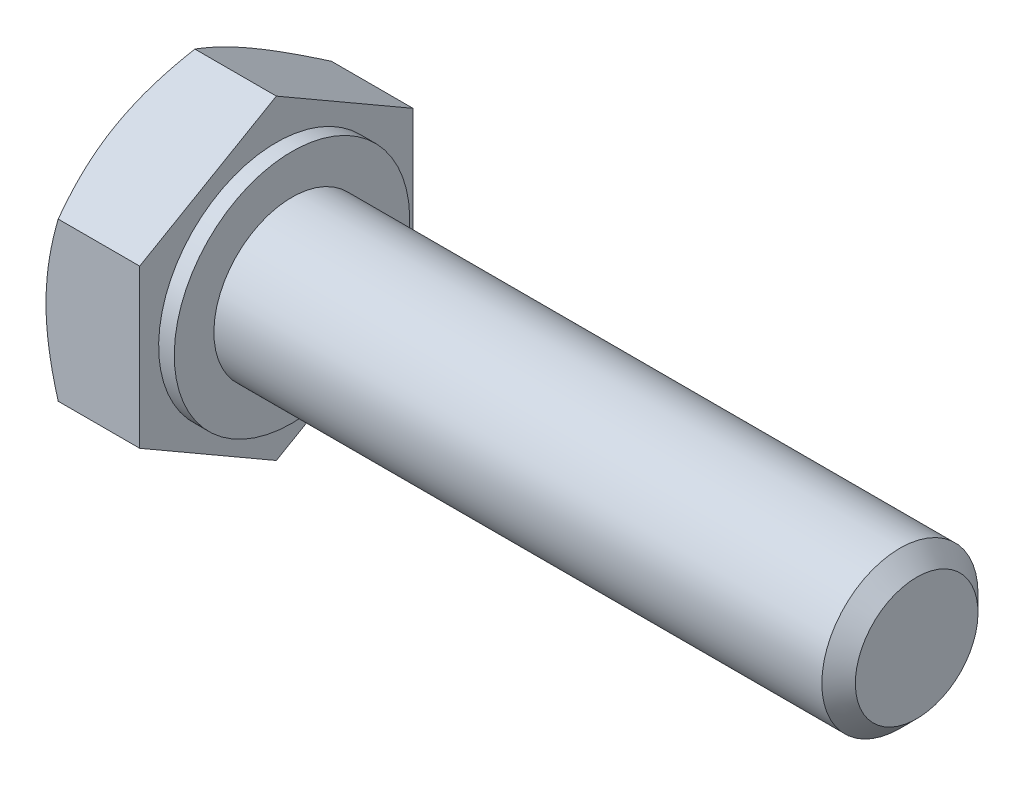
ISO-10303-21;
HEADER;
FILE_DESCRIPTION(('STEP AP214'),'2;1');
FILE_NAME('part.step','',(''),(''),'','','');
FILE_SCHEMA(('AUTOMOTIVE_DESIGN { 1 0 10303 214 1 1 1 1 }'));
ENDSEC;
DATA;
#1=APPLICATION_CONTEXT('core data for automotive mechanical design processes');
#2=APPLICATION_PROTOCOL_DEFINITION('international standard','automotive_design',2000,#1);
#3=PRODUCT_CONTEXT('',#1,'mechanical');
#4=PRODUCT('Part','Part','',(#3));
#5=PRODUCT_RELATED_PRODUCT_CATEGORY('part','',(#4));
#6=PRODUCT_DEFINITION_FORMATION('','',#4);
#7=PRODUCT_DEFINITION_CONTEXT('part definition',#1,'design');
#8=PRODUCT_DEFINITION('design','',#6,#7);
#9=PRODUCT_DEFINITION_SHAPE('','',#8);
#10=(LENGTH_UNIT() NAMED_UNIT(*) SI_UNIT(.MILLI.,.METRE.));
#11=(NAMED_UNIT(*) PLANE_ANGLE_UNIT() SI_UNIT($,.RADIAN.));
#12=(NAMED_UNIT(*) SI_UNIT($,.STERADIAN.) SOLID_ANGLE_UNIT());
#13=UNCERTAINTY_MEASURE_WITH_UNIT(LENGTH_MEASURE(1.E-05),#10,'distance_accuracy_value','');
#14=(GEOMETRIC_REPRESENTATION_CONTEXT(3) GLOBAL_UNCERTAINTY_ASSIGNED_CONTEXT((#13)) GLOBAL_UNIT_ASSIGNED_CONTEXT((#10,
#11,#12)) REPRESENTATION_CONTEXT('',''));
#15=CARTESIAN_POINT('',(0.,0.,0.));
#16=DIRECTION('',(0.,0.,1.));
#17=DIRECTION('',(1.,0.,0.));
#18=AXIS2_PLACEMENT_3D('',#15,#16,#17);
#19=CARTESIAN_POINT('',(0.,2.5075,0.));
#20=DIRECTION('',(1.,0.,0.));
#21=DIRECTION('',(0.,1.,0.));
#22=AXIS2_PLACEMENT_3D('',#19,#20,#21);
#23=PLANE('',#22);
#24=CARTESIAN_POINT('',(0.,0.,0.));
#25=DIRECTION('',(1.,0.,0.));
#26=DIRECTION('',(0.,1.,0.));
#27=AXIS2_PLACEMENT_3D('',#24,#25,#26);
#28=CIRCLE('',#27,2.);
#29=CARTESIAN_POINT('',(0.,-2.,0.));
#30=VERTEX_POINT('',#29);
#31=EDGE_CURVE('E130',#30,#30,#28,.T.);
#32=ORIENTED_EDGE('',*,*,#31,.F.);
#33=EDGE_LOOP('',(#32));
#34=FACE_BOUND('',#33,.T.);
#35=CARTESIAN_POINT('',(0.,0.,0.));
#36=DIRECTION('',(1.,0.,0.));
#37=DIRECTION('',(0.,1.,0.));
#38=AXIS2_PLACEMENT_3D('',#35,#36,#37);
#39=CIRCLE('',#38,3.015);
#40=CARTESIAN_POINT('',(0.,-3.015,0.));
#41=VERTEX_POINT('',#40);
#42=EDGE_CURVE('E30',#41,#41,#39,.T.);
#43=ORIENTED_EDGE('',*,*,#42,.T.);
#44=EDGE_LOOP('',(#43));
#45=FACE_BOUND('',#44,.T.);
#46=ADVANCED_FACE('F17',(#34,#45),#23,.T.);
#47=CARTESIAN_POINT('',(-0.200049999999994,0.,0.));
#48=DIRECTION('',(1.,0.,0.));
#49=DIRECTION('',(0.,1.,0.));
#50=AXIS2_PLACEMENT_3D('',#47,#48,#49);
#51=CYLINDRICAL_SURFACE('',#50,3.015);
#52=ORIENTED_EDGE('',*,*,#42,.F.);
#53=DIRECTION('',(-1.,0.,0.));
#54=VECTOR('',#53,1.);
#55=CARTESIAN_POINT('',(-0.200049999999994,-3.015,0.));
#56=LINE('',#55,#54);
#57=CARTESIAN_POINT('',(-0.400099999999995,-3.015,0.));
#58=VERTEX_POINT('',#57);
#59=EDGE_CURVE('E11',#41,#58,#56,.T.);
#60=ORIENTED_EDGE('',*,*,#59,.T.);
#61=CARTESIAN_POINT('',(-0.400099999999994,0.,0.));
#62=DIRECTION('',(1.,0.,0.));
#63=DIRECTION('',(0.,1.,0.));
#64=AXIS2_PLACEMENT_3D('',#61,#62,#63);
#65=CIRCLE('',#64,3.015);
#66=EDGE_CURVE('E253',#58,#58,#65,.T.);
#67=ORIENTED_EDGE('',*,*,#66,.T.);
#68=ORIENTED_EDGE('',*,*,#59,.F.);
#69=EDGE_LOOP('',(#52,#60,#67,#68));
#70=FACE_BOUND('',#69,.T.);
#71=ADVANCED_FACE('F360',(#70),#51,.T.);
#72=CARTESIAN_POINT('',(-2.8001,0.,0.));
#73=DIRECTION('',(1.,0.,0.));
#74=DIRECTION('',(0.,1.,0.));
#75=AXIS2_PLACEMENT_3D('',#72,#73,#74);
#76=PLANE('',#75);
#77=CARTESIAN_POINT('',(-2.8001,0.,0.));
#78=DIRECTION('',(-1.,0.,0.));
#79=DIRECTION('',(0.,1.,0.));
#80=AXIS2_PLACEMENT_3D('',#77,#78,#79);
#81=CIRCLE('',#80,3.5);
#82=CARTESIAN_POINT('',(-2.8001,0.,3.5));
#83=VERTEX_POINT('',#82);
#84=CARTESIAN_POINT('',(-2.8001,3.03108891324553,1.75));
#85=VERTEX_POINT('',#84);
#86=EDGE_CURVE('E144',#83,#85,#81,.T.);
#87=ORIENTED_EDGE('',*,*,#86,.T.);
#88=CARTESIAN_POINT('',(-2.8001,0.,0.));
#89=DIRECTION('',(-1.,0.,0.));
#90=DIRECTION('',(0.,1.,0.));
#91=AXIS2_PLACEMENT_3D('',#88,#89,#90);
#92=CIRCLE('',#91,3.5);
#93=CARTESIAN_POINT('',(-2.8001,3.03108891324553,-1.75));
#94=VERTEX_POINT('',#93);
#95=EDGE_CURVE('E236',#85,#94,#92,.T.);
#96=ORIENTED_EDGE('',*,*,#95,.T.);
#97=CARTESIAN_POINT('',(-2.8001,0.,0.));
#98=DIRECTION('',(-1.,0.,0.));
#99=DIRECTION('',(0.,1.,0.));
#100=AXIS2_PLACEMENT_3D('',#97,#98,#99);
#101=CIRCLE('',#100,3.5);
#102=CARTESIAN_POINT('',(-2.8001,0.,-3.5));
#103=VERTEX_POINT('',#102);
#104=EDGE_CURVE('E186',#94,#103,#101,.T.);
#105=ORIENTED_EDGE('',*,*,#104,.T.);
#106=CARTESIAN_POINT('',(-2.8001,0.,0.));
#107=DIRECTION('',(-1.,0.,0.));
#108=DIRECTION('',(0.,1.,0.));
#109=AXIS2_PLACEMENT_3D('',#106,#107,#108);
#110=CIRCLE('',#109,3.5);
#111=CARTESIAN_POINT('',(-2.8001,-3.03108891324553,-1.75));
#112=VERTEX_POINT('',#111);
#113=EDGE_CURVE('E150',#103,#112,#110,.T.);
#114=ORIENTED_EDGE('',*,*,#113,.T.);
#115=CARTESIAN_POINT('',(-2.8001,0.,0.));
#116=DIRECTION('',(-1.,0.,0.));
#117=DIRECTION('',(0.,1.,0.));
#118=AXIS2_PLACEMENT_3D('',#115,#116,#117);
#119=CIRCLE('',#118,3.5);
#120=CARTESIAN_POINT('',(-2.8001,-3.03108891324553,1.75));
#121=VERTEX_POINT('',#120);
#122=EDGE_CURVE('E307',#112,#121,#119,.T.);
#123=ORIENTED_EDGE('',*,*,#122,.T.);
#124=CARTESIAN_POINT('',(-2.8001,0.,0.));
#125=DIRECTION('',(-1.,0.,0.));
#126=DIRECTION('',(0.,1.,0.));
#127=AXIS2_PLACEMENT_3D('',#124,#125,#126);
#128=CIRCLE('',#127,3.5);
#129=EDGE_CURVE('E222',#121,#83,#128,.T.);
#130=ORIENTED_EDGE('',*,*,#129,.T.);
#131=EDGE_LOOP('',(#87,#96,#105,#114,#123,#130));
#132=FACE_BOUND('',#131,.T.);
#133=ADVANCED_FACE('F366',(#132),#76,.F.);
#134=CARTESIAN_POINT('',(-0.400099999999993,-4.04145188432738,0.));
#135=DIRECTION('',(0.,-0.866025403784439,-0.5));
#136=DIRECTION('',(0.,0.5,-0.866025403784439));
#137=AXIS2_PLACEMENT_3D('',#134,#135,#136);
#138=PLANE('',#137);
#139=CARTESIAN_POINT('',(-2.8001,-3.03108891324553,-1.75));
#140=CARTESIAN_POINT('',(-2.80010000000001,-2.56217782649107,-2.56217782649106));
#141=CARTESIAN_POINT('',(-2.48749260883037,-2.0207259421637,-3.5));
#142=(BOUNDED_CURVE() B_SPLINE_CURVE(2,(#139,#140,#141),.UNSPECIFIED.,.F.,
.F.) B_SPLINE_CURVE_WITH_KNOTS((3,3),(0.204998401571332,0.409996803142664),
.UNSPECIFIED.) CURVE() GEOMETRIC_REPRESENTATION_ITEM() RATIONAL_B_SPLINE_CURVE((1.,
1.03795484930207,1.)) REPRESENTATION_ITEM(''));
#143=CARTESIAN_POINT('',(-2.48749260883038,-2.0207259421637,-3.5));
#144=VERTEX_POINT('',#143);
#145=EDGE_CURVE('E158',#112,#144,#142,.T.);
#146=ORIENTED_EDGE('',*,*,#145,.T.);
#147=DIRECTION('',(-1.,0.,0.));
#148=VECTOR('',#147,1.);
#149=CARTESIAN_POINT('',(-0.400099999999993,-2.02072594216369,-3.5));
#150=LINE('',#149,#148);
#151=CARTESIAN_POINT('',(-0.400099999999993,-2.02072594216369,-3.5));
#152=VERTEX_POINT('',#151);
#153=EDGE_CURVE('E212',#152,#144,#150,.T.);
#154=ORIENTED_EDGE('',*,*,#153,.F.);
#155=DIRECTION('',(0.,0.5,-0.866025403784439));
#156=VECTOR('',#155,1.);
#157=CARTESIAN_POINT('',(-0.400099999999993,-4.04145188432738,0.));
#158=LINE('',#157,#156);
#159=CARTESIAN_POINT('',(-0.400099999999993,-4.04145188432738,0.));
#160=VERTEX_POINT('',#159);
#161=EDGE_CURVE('E156',#160,#152,#158,.T.);
#162=ORIENTED_EDGE('',*,*,#161,.F.);
#163=DIRECTION('',(-1.,0.,0.));
#164=VECTOR('',#163,1.);
#165=CARTESIAN_POINT('',(-0.400099999999993,-4.04145188432738,0.));
#166=LINE('',#165,#164);
#167=CARTESIAN_POINT('',(-2.48749260883038,-4.04145188432736,0.));
#168=VERTEX_POINT('',#167);
#169=EDGE_CURVE('E252',#160,#168,#166,.T.);
#170=ORIENTED_EDGE('',*,*,#169,.T.);
#171=CARTESIAN_POINT('',(-2.48749260883038,-4.04145188432736,0.));
#172=CARTESIAN_POINT('',(-2.80010000000001,-3.49999999999999,-0.937822173508942));
#173=CARTESIAN_POINT('',(-2.8001,-3.03108891324553,-1.75));
#174=(BOUNDED_CURVE() B_SPLINE_CURVE(2,(#171,#172,#173),.UNSPECIFIED.,.F.,
.F.) B_SPLINE_CURVE_WITH_KNOTS((3,3),(0.,0.204998401571332),
.UNSPECIFIED.) CURVE() GEOMETRIC_REPRESENTATION_ITEM() RATIONAL_B_SPLINE_CURVE((1.,
1.03795484930205,1.)) REPRESENTATION_ITEM(''));
#175=EDGE_CURVE('E21',#168,#112,#174,.T.);
#176=ORIENTED_EDGE('',*,*,#175,.T.);
#177=EDGE_LOOP('',(#146,#154,#162,#170,#176));
#178=FACE_BOUND('',#177,.T.);
#179=ADVANCED_FACE('F386',(#178),#138,.T.);
#180=CARTESIAN_POINT('',(-0.400099999999993,-2.02072594216369,3.5));
#181=DIRECTION('',(0.,-0.866025403784439,0.5));
#182=DIRECTION('',(-1.,0.,0.));
#183=AXIS2_PLACEMENT_3D('',#180,#181,#182);
#184=PLANE('',#183);
#185=CARTESIAN_POINT('',(-2.8001,-3.03108891324553,1.75));
#186=CARTESIAN_POINT('',(-2.80010000000001,-3.49999999999999,0.937822173508936));
#187=CARTESIAN_POINT('',(-2.48749260883038,-4.04145188432736,0.));
#188=(BOUNDED_CURVE() B_SPLINE_CURVE(2,(#185,#186,#187),.UNSPECIFIED.,.F.,
.F.) B_SPLINE_CURVE_WITH_KNOTS((3,3),(0.204998401571332,0.409996803142664),
.UNSPECIFIED.) CURVE() GEOMETRIC_REPRESENTATION_ITEM() RATIONAL_B_SPLINE_CURVE((1.,
1.03795484930205,1.)) REPRESENTATION_ITEM(''));
#189=EDGE_CURVE('E298',#121,#168,#188,.T.);
#190=ORIENTED_EDGE('',*,*,#189,.T.);
#191=ORIENTED_EDGE('',*,*,#169,.F.);
#192=DIRECTION('',(0.,-0.5,-0.866025403784439));
#193=VECTOR('',#192,1.);
#194=CARTESIAN_POINT('',(-0.400099999999993,-2.02072594216369,3.5));
#195=LINE('',#194,#193);
#196=CARTESIAN_POINT('',(-0.400099999999993,-2.02072594216369,3.5));
#197=VERTEX_POINT('',#196);
#198=EDGE_CURVE('E152',#197,#160,#195,.T.);
#199=ORIENTED_EDGE('',*,*,#198,.F.);
#200=DIRECTION('',(-1.,0.,0.));
#201=VECTOR('',#200,1.);
#202=CARTESIAN_POINT('',(-0.400099999999993,-2.02072594216369,3.5));
#203=LINE('',#202,#201);
#204=CARTESIAN_POINT('',(-2.48749260883038,-2.02072594216366,3.5));
#205=VERTEX_POINT('',#204);
#206=EDGE_CURVE('E249',#197,#205,#203,.T.);
#207=ORIENTED_EDGE('',*,*,#206,.T.);
#208=CARTESIAN_POINT('',(-2.48749260883038,-2.02072594216371,3.5));
#209=CARTESIAN_POINT('',(-2.80010000000001,-2.56217782649108,2.56217782649106));
#210=CARTESIAN_POINT('',(-2.8001,-3.03108891324553,1.75));
#211=(BOUNDED_CURVE() B_SPLINE_CURVE(2,(#208,#209,#210),.UNSPECIFIED.,.F.,
.F.) B_SPLINE_CURVE_WITH_KNOTS((3,3),(0.,0.204998401571332),
.UNSPECIFIED.) CURVE() GEOMETRIC_REPRESENTATION_ITEM() RATIONAL_B_SPLINE_CURVE((1.,
1.03795484930205,1.)) REPRESENTATION_ITEM(''));
#212=EDGE_CURVE('E289',#205,#121,#211,.T.);
#213=ORIENTED_EDGE('',*,*,#212,.T.);
#214=EDGE_LOOP('',(#190,#191,#199,#207,#213));
#215=FACE_BOUND('',#214,.T.);
#216=ADVANCED_FACE('F383',(#215),#184,.T.);
#217=CARTESIAN_POINT('',(-0.400099999999994,2.02072594216369,3.5));
#218=DIRECTION('',(0.,0.,1.));
#219=DIRECTION('',(0.,-1.,0.));
#220=AXIS2_PLACEMENT_3D('',#217,#218,#219);
#221=PLANE('',#220);
#222=CARTESIAN_POINT('',(-2.8001,0.,3.5));
#223=CARTESIAN_POINT('',(-2.80010000000001,-0.937822173508923,3.5));
#224=CARTESIAN_POINT('',(-2.48749260883038,-2.02072594216366,3.5));
#225=(BOUNDED_CURVE() B_SPLINE_CURVE(2,(#222,#223,#224),.UNSPECIFIED.,.F.,
.F.) B_SPLINE_CURVE_WITH_KNOTS((3,3),(0.204998401571332,0.409996803142664),
.UNSPECIFIED.) CURVE() GEOMETRIC_REPRESENTATION_ITEM() RATIONAL_B_SPLINE_CURVE((1.,
1.03795484930203,1.)) REPRESENTATION_ITEM(''));
#226=EDGE_CURVE('E226',#83,#205,#225,.T.);
#227=ORIENTED_EDGE('',*,*,#226,.T.);
#228=ORIENTED_EDGE('',*,*,#206,.F.);
#229=DIRECTION('',(0.,-1.,0.));
#230=VECTOR('',#229,1.);
#231=CARTESIAN_POINT('',(-0.400099999999994,2.02072594216369,3.5));
#232=LINE('',#231,#230);
#233=CARTESIAN_POINT('',(-0.400099999999994,2.02072594216369,3.5));
#234=VERTEX_POINT('',#233);
#235=EDGE_CURVE('E157',#234,#197,#232,.T.);
#236=ORIENTED_EDGE('',*,*,#235,.F.);
#237=DIRECTION('',(-1.,0.,0.));
#238=VECTOR('',#237,1.);
#239=CARTESIAN_POINT('',(-0.400099999999994,2.02072594216369,3.5));
#240=LINE('',#239,#238);
#241=CARTESIAN_POINT('',(-2.48749260883038,2.02072594216366,3.5));
#242=VERTEX_POINT('',#241);
#243=EDGE_CURVE('E230',#234,#242,#240,.T.);
#244=ORIENTED_EDGE('',*,*,#243,.T.);
#245=CARTESIAN_POINT('',(-2.48749260883037,2.02072594216366,3.5));
#246=CARTESIAN_POINT('',(-2.80010000000001,0.937822173508917,3.5));
#247=CARTESIAN_POINT('',(-2.8001,0.,3.5));
#248=(BOUNDED_CURVE() B_SPLINE_CURVE(2,(#245,#246,#247),.UNSPECIFIED.,.F.,
.F.) B_SPLINE_CURVE_WITH_KNOTS((3,3),(0.,0.204998401571332),
.UNSPECIFIED.) CURVE() GEOMETRIC_REPRESENTATION_ITEM() RATIONAL_B_SPLINE_CURVE((1.,
1.03795484930204,1.)) REPRESENTATION_ITEM(''));
#249=EDGE_CURVE('E235',#242,#83,#248,.T.);
#250=ORIENTED_EDGE('',*,*,#249,.T.);
#251=EDGE_LOOP('',(#227,#228,#236,#244,#250));
#252=FACE_BOUND('',#251,.T.);
#253=ADVANCED_FACE('F385',(#252),#221,.T.);
#254=CARTESIAN_POINT('',(-0.400099999999993,0.,0.));
#255=DIRECTION('',(1.,0.,0.));
#256=DIRECTION('',(0.,1.,0.));
#257=AXIS2_PLACEMENT_3D('',#254,#255,#256);
#258=PLANE('',#257);
#259=ORIENTED_EDGE('',*,*,#66,.F.);
#260=EDGE_LOOP('',(#259));
#261=FACE_BOUND('',#260,.T.);
#262=DIRECTION('',(0.,-0.5,0.866025403784438));
#263=VECTOR('',#262,1.);
#264=CARTESIAN_POINT('',(-0.400099999999994,4.04145188432738,0.));
#265=LINE('',#264,#263);
#266=CARTESIAN_POINT('',(-0.400099999999994,4.04145188432738,0.));
#267=VERTEX_POINT('',#266);
#268=EDGE_CURVE('E243',#267,#234,#265,.T.);
#269=ORIENTED_EDGE('',*,*,#268,.T.);
#270=ORIENTED_EDGE('',*,*,#235,.T.);
#271=ORIENTED_EDGE('',*,*,#198,.T.);
#272=ORIENTED_EDGE('',*,*,#161,.T.);
#273=DIRECTION('',(0.,1.,0.));
#274=VECTOR('',#273,1.);
#275=CARTESIAN_POINT('',(-0.400099999999993,-2.02072594216369,-3.5));
#276=LINE('',#275,#274);
#277=CARTESIAN_POINT('',(-0.400099999999994,2.02072594216369,-3.5));
#278=VERTEX_POINT('',#277);
#279=EDGE_CURVE('E216',#152,#278,#276,.T.);
#280=ORIENTED_EDGE('',*,*,#279,.T.);
#281=DIRECTION('',(0.,0.5,0.866025403784439));
#282=VECTOR('',#281,1.);
#283=CARTESIAN_POINT('',(-0.400099999999994,2.02072594216369,-3.5));
#284=LINE('',#283,#282);
#285=EDGE_CURVE('E227',#278,#267,#284,.T.);
#286=ORIENTED_EDGE('',*,*,#285,.T.);
#287=EDGE_LOOP('',(#269,#270,#271,#272,#280,#286));
#288=FACE_BOUND('',#287,.T.);
#289=ADVANCED_FACE('F371',(#261,#288),#258,.T.);
#290=CARTESIAN_POINT('',(-0.400099999999994,4.04145188432738,0.));
#291=DIRECTION('',(0.,0.866025403784438,0.5));
#292=DIRECTION('',(1.,0.,0.));
#293=AXIS2_PLACEMENT_3D('',#290,#291,#292);
#294=PLANE('',#293);
#295=CARTESIAN_POINT('',(-2.48749260883038,4.04145188432736,0.));
#296=CARTESIAN_POINT('',(-2.80010000000001,3.49999999999999,0.937822173508938));
#297=CARTESIAN_POINT('',(-2.8001,3.03108891324553,1.75));
#298=(BOUNDED_CURVE() B_SPLINE_CURVE(2,(#295,#296,#297),.UNSPECIFIED.,.F.,
.F.) B_SPLINE_CURVE_WITH_KNOTS((3,3),(0.,0.204998401571332),
.UNSPECIFIED.) CURVE() GEOMETRIC_REPRESENTATION_ITEM() RATIONAL_B_SPLINE_CURVE((1.,
1.03795484930204,1.)) REPRESENTATION_ITEM(''));
#299=CARTESIAN_POINT('',(-2.48749260883038,4.04145188432736,0.));
#300=VERTEX_POINT('',#299);
#301=EDGE_CURVE('E240',#300,#85,#298,.T.);
#302=ORIENTED_EDGE('',*,*,#301,.T.);
#303=CARTESIAN_POINT('',(-2.8001,3.03108891324553,1.75));
#304=CARTESIAN_POINT('',(-2.80010000000001,2.56217782649107,2.56217782649106));
#305=CARTESIAN_POINT('',(-2.48749260883038,2.0207259421637,3.5));
#306=(BOUNDED_CURVE() B_SPLINE_CURVE(2,(#303,#304,#305),.UNSPECIFIED.,.F.,
.F.) B_SPLINE_CURVE_WITH_KNOTS((3,3),(0.204998401571332,0.409996803142664),
.UNSPECIFIED.) CURVE() GEOMETRIC_REPRESENTATION_ITEM() RATIONAL_B_SPLINE_CURVE((1.,
1.03795484930205,1.)) REPRESENTATION_ITEM(''));
#307=EDGE_CURVE('E136',#85,#242,#306,.T.);
#308=ORIENTED_EDGE('',*,*,#307,.T.);
#309=ORIENTED_EDGE('',*,*,#243,.F.);
#310=ORIENTED_EDGE('',*,*,#268,.F.);
#311=DIRECTION('',(-1.,0.,0.));
#312=VECTOR('',#311,1.);
#313=CARTESIAN_POINT('',(-0.400099999999994,4.04145188432738,0.));
#314=LINE('',#313,#312);
#315=EDGE_CURVE('E215',#267,#300,#314,.T.);
#316=ORIENTED_EDGE('',*,*,#315,.T.);
#317=EDGE_LOOP('',(#302,#308,#309,#310,#316));
#318=FACE_BOUND('',#317,.T.);
#319=ADVANCED_FACE('F378',(#318),#294,.T.);
#320=CARTESIAN_POINT('',(-0.400099999999994,2.02072594216369,-3.5));
#321=DIRECTION('',(0.,0.866025403784439,-0.5));
#322=DIRECTION('',(-1.,0.,0.));
#323=AXIS2_PLACEMENT_3D('',#320,#321,#322);
#324=PLANE('',#323);
#325=CARTESIAN_POINT('',(-2.48749260883038,2.0207259421637,-3.5));
#326=CARTESIAN_POINT('',(-2.80010000000001,2.56217782649108,-2.56217782649105));
#327=CARTESIAN_POINT('',(-2.8001,3.03108891324553,-1.75));
#328=(BOUNDED_CURVE() B_SPLINE_CURVE(2,(#325,#326,#327),.UNSPECIFIED.,.F.,
.F.) B_SPLINE_CURVE_WITH_KNOTS((3,3),(0.,0.204998401571332),
.UNSPECIFIED.) CURVE() GEOMETRIC_REPRESENTATION_ITEM() RATIONAL_B_SPLINE_CURVE((1.,
1.03795484930204,1.)) REPRESENTATION_ITEM(''));
#329=CARTESIAN_POINT('',(-2.48749260883038,2.02072594216366,-3.5));
#330=VERTEX_POINT('',#329);
#331=EDGE_CURVE('E178',#330,#94,#328,.T.);
#332=ORIENTED_EDGE('',*,*,#331,.T.);
#333=CARTESIAN_POINT('',(-2.8001,3.03108891324553,-1.75));
#334=CARTESIAN_POINT('',(-2.80010000000001,3.49999999999999,-0.937822173508939));
#335=CARTESIAN_POINT('',(-2.48749260883038,4.04145188432736,0.));
#336=(BOUNDED_CURVE() B_SPLINE_CURVE(2,(#333,#334,#335),.UNSPECIFIED.,.F.,
.F.) B_SPLINE_CURVE_WITH_KNOTS((3,3),(0.204998401571332,0.409996803142665),
.UNSPECIFIED.) CURVE() GEOMETRIC_REPRESENTATION_ITEM() RATIONAL_B_SPLINE_CURVE((1.,
1.03795484930206,1.)) REPRESENTATION_ITEM(''));
#337=EDGE_CURVE('E225',#94,#300,#336,.T.);
#338=ORIENTED_EDGE('',*,*,#337,.T.);
#339=ORIENTED_EDGE('',*,*,#315,.F.);
#340=ORIENTED_EDGE('',*,*,#285,.F.);
#341=DIRECTION('',(-1.,0.,0.));
#342=VECTOR('',#341,1.);
#343=CARTESIAN_POINT('',(-0.400099999999994,2.02072594216369,-3.5));
#344=LINE('',#343,#342);
#345=EDGE_CURVE('E176',#278,#330,#344,.T.);
#346=ORIENTED_EDGE('',*,*,#345,.T.);
#347=EDGE_LOOP('',(#332,#338,#339,#340,#346));
#348=FACE_BOUND('',#347,.T.);
#349=ADVANCED_FACE('F381',(#348),#324,.T.);
#350=CARTESIAN_POINT('',(-0.400099999999993,-2.02072594216369,-3.5));
#351=DIRECTION('',(0.,0.,-1.));
#352=DIRECTION('',(-1.,0.,0.));
#353=AXIS2_PLACEMENT_3D('',#350,#351,#352);
#354=PLANE('',#353);
#355=CARTESIAN_POINT('',(-2.48749260883038,-2.02072594216366,-3.5));
#356=CARTESIAN_POINT('',(-2.80010000000001,-0.937822173508916,-3.5));
#357=CARTESIAN_POINT('',(-2.8001,0.,-3.5));
#358=(BOUNDED_CURVE() B_SPLINE_CURVE(2,(#355,#356,#357),.UNSPECIFIED.,.F.,
.F.) B_SPLINE_CURVE_WITH_KNOTS((3,3),(0.,0.204998401571332),
.UNSPECIFIED.) CURVE() GEOMETRIC_REPRESENTATION_ITEM() RATIONAL_B_SPLINE_CURVE((1.,
1.03795484930204,1.)) REPRESENTATION_ITEM(''));
#359=EDGE_CURVE('E163',#144,#103,#358,.T.);
#360=ORIENTED_EDGE('',*,*,#359,.T.);
#361=CARTESIAN_POINT('',(-2.8001,0.,-3.5));
#362=CARTESIAN_POINT('',(-2.80010000000001,0.937822173508917,-3.5));
#363=CARTESIAN_POINT('',(-2.48749260883038,2.02072594216366,-3.5));
#364=(BOUNDED_CURVE() B_SPLINE_CURVE(2,(#361,#362,#363),.UNSPECIFIED.,.F.,
.F.) B_SPLINE_CURVE_WITH_KNOTS((3,3),(0.204998401571332,0.409996803142664),
.UNSPECIFIED.) CURVE() GEOMETRIC_REPRESENTATION_ITEM() RATIONAL_B_SPLINE_CURVE((1.,
1.03795484930204,1.)) REPRESENTATION_ITEM(''));
#365=EDGE_CURVE('E208',#103,#330,#364,.T.);
#366=ORIENTED_EDGE('',*,*,#365,.T.);
#367=ORIENTED_EDGE('',*,*,#345,.F.);
#368=ORIENTED_EDGE('',*,*,#279,.F.);
#369=ORIENTED_EDGE('',*,*,#153,.T.);
#370=EDGE_LOOP('',(#360,#366,#367,#368,#369));
#371=FACE_BOUND('',#370,.T.);
#372=ADVANCED_FACE('F389',(#371),#354,.T.);
#373=CARTESIAN_POINT('',(-2.64379630441519,0.,0.));
#374=DIRECTION('',(1.,0.,0.));
#375=DIRECTION('',(0.,1.,0.));
#376=AXIS2_PLACEMENT_3D('',#373,#374,#375);
#377=CONICAL_SURFACE('',#376,3.77072594216368,1.0471975511966);
#378=ORIENTED_EDGE('',*,*,#359,.F.);
#379=ORIENTED_EDGE('',*,*,#145,.F.);
#380=ORIENTED_EDGE('',*,*,#113,.F.);
#381=EDGE_LOOP('',(#378,#379,#380));
#382=FACE_BOUND('',#381,.T.);
#383=ADVANCED_FACE('F391',(#382),#377,.T.);
#384=CARTESIAN_POINT('',(-2.64379630441519,0.,0.));
#385=DIRECTION('',(1.,0.,0.));
#386=DIRECTION('',(0.,1.,0.));
#387=AXIS2_PLACEMENT_3D('',#384,#385,#386);
#388=CONICAL_SURFACE('',#387,3.77072594216368,1.0471975511966);
#389=ORIENTED_EDGE('',*,*,#365,.F.);
#390=ORIENTED_EDGE('',*,*,#104,.F.);
#391=ORIENTED_EDGE('',*,*,#331,.F.);
#392=EDGE_LOOP('',(#389,#390,#391));
#393=FACE_BOUND('',#392,.T.);
#394=ADVANCED_FACE('F375',(#393),#388,.T.);
#395=CARTESIAN_POINT('',(-2.64379630441519,0.,0.));
#396=DIRECTION('',(1.,0.,0.));
#397=DIRECTION('',(0.,-1.,0.));
#398=AXIS2_PLACEMENT_3D('',#395,#396,#397);
#399=CONICAL_SURFACE('',#398,3.77072594216368,1.0471975511966);
#400=ORIENTED_EDGE('',*,*,#175,.F.);
#401=ORIENTED_EDGE('',*,*,#189,.F.);
#402=ORIENTED_EDGE('',*,*,#122,.F.);
#403=EDGE_LOOP('',(#400,#401,#402));
#404=FACE_BOUND('',#403,.T.);
#405=ADVANCED_FACE('F372',(#404),#399,.T.);
#406=CARTESIAN_POINT('',(-2.64379630441519,0.,0.));
#407=DIRECTION('',(1.,0.,0.));
#408=DIRECTION('',(0.,1.,0.));
#409=AXIS2_PLACEMENT_3D('',#406,#407,#408);
#410=CONICAL_SURFACE('',#409,3.77072594216368,1.0471975511966);
#411=ORIENTED_EDGE('',*,*,#337,.F.);
#412=ORIENTED_EDGE('',*,*,#95,.F.);
#413=ORIENTED_EDGE('',*,*,#301,.F.);
#414=EDGE_LOOP('',(#411,#412,#413));
#415=FACE_BOUND('',#414,.T.);
#416=ADVANCED_FACE('F374',(#415),#410,.T.);
#417=CARTESIAN_POINT('',(-2.64379630441519,0.,0.));
#418=DIRECTION('',(1.,0.,0.));
#419=DIRECTION('',(0.,1.,0.));
#420=AXIS2_PLACEMENT_3D('',#417,#418,#419);
#421=CONICAL_SURFACE('',#420,3.77072594216368,1.0471975511966);
#422=ORIENTED_EDGE('',*,*,#212,.F.);
#423=ORIENTED_EDGE('',*,*,#226,.F.);
#424=ORIENTED_EDGE('',*,*,#129,.F.);
#425=EDGE_LOOP('',(#422,#423,#424));
#426=FACE_BOUND('',#425,.T.);
#427=ADVANCED_FACE('F354',(#426),#421,.T.);
#428=CARTESIAN_POINT('',(-2.64379630441519,0.,0.));
#429=DIRECTION('',(1.,0.,0.));
#430=DIRECTION('',(0.,1.,0.));
#431=AXIS2_PLACEMENT_3D('',#428,#429,#430);
#432=CONICAL_SURFACE('',#431,3.77072594216368,1.0471975511966);
#433=ORIENTED_EDGE('',*,*,#307,.F.);
#434=ORIENTED_EDGE('',*,*,#86,.F.);
#435=ORIENTED_EDGE('',*,*,#249,.F.);
#436=EDGE_LOOP('',(#433,#434,#435));
#437=FACE_BOUND('',#436,.T.);
#438=ADVANCED_FACE('F346',(#437),#432,.T.);
#439=CARTESIAN_POINT('',(16.,1.,0.));
#440=DIRECTION('',(1.,0.,0.));
#441=DIRECTION('',(0.,1.,0.));
#442=AXIS2_PLACEMENT_3D('',#439,#440,#441);
#443=PLANE('',#442);
#444=CARTESIAN_POINT('',(16.,0.,0.));
#445=DIRECTION('',(-1.,0.,0.));
#446=DIRECTION('',(0.,-1.,0.));
#447=AXIS2_PLACEMENT_3D('',#444,#445,#446);
#448=CIRCLE('',#447,1.570585);
#449=CARTESIAN_POINT('',(16.,1.570585,0.));
#450=VERTEX_POINT('',#449);
#451=EDGE_CURVE('E221',#450,#450,#448,.T.);
#452=ORIENTED_EDGE('',*,*,#451,.F.);
#453=EDGE_LOOP('',(#452));
#454=FACE_BOUND('',#453,.T.);
#455=ADVANCED_FACE('F344',(#454),#443,.T.);
#456=CARTESIAN_POINT('',(9.05,0.,0.));
#457=DIRECTION('',(1.,0.,0.));
#458=DIRECTION('',(0.,1.,0.));
#459=AXIS2_PLACEMENT_3D('',#456,#457,#458);
#460=CYLINDRICAL_SURFACE('',#459,2.);
#461=CARTESIAN_POINT('',(15.570485,0.,0.));
#462=DIRECTION('',(1.,0.,0.));
#463=DIRECTION('',(0.,-1.,0.));
#464=AXIS2_PLACEMENT_3D('',#461,#462,#463);
#465=CIRCLE('',#464,2.);
#466=CARTESIAN_POINT('',(15.570485,2.,0.));
#467=VERTEX_POINT('',#466);
#468=CARTESIAN_POINT('',(15.570485,-2.,0.));
#469=VERTEX_POINT('',#468);
#470=EDGE_CURVE('E211',#467,#469,#465,.T.);
#471=ORIENTED_EDGE('',*,*,#470,.F.);
#472=CARTESIAN_POINT('',(15.570485,0.,0.));
#473=DIRECTION('',(1.,0.,0.));
#474=DIRECTION('',(0.,-1.,0.));
#475=AXIS2_PLACEMENT_3D('',#472,#473,#474);
#476=CIRCLE('',#475,2.);
#477=EDGE_CURVE('E146',#469,#467,#476,.T.);
#478=ORIENTED_EDGE('',*,*,#477,.F.);
#479=DIRECTION('',(-1.,0.,0.));
#480=VECTOR('',#479,1.);
#481=CARTESIAN_POINT('',(9.05,-2.,0.));
#482=LINE('',#481,#480);
#483=EDGE_CURVE('E132',#469,#30,#482,.T.);
#484=ORIENTED_EDGE('',*,*,#483,.T.);
#485=ORIENTED_EDGE('',*,*,#31,.T.);
#486=ORIENTED_EDGE('',*,*,#483,.F.);
#487=EDGE_LOOP('',(#471,#478,#484,#485,#486));
#488=FACE_BOUND('',#487,.T.);
#489=ADVANCED_FACE('F19',(#488),#460,.T.);
#490=CARTESIAN_POINT('',(15.7852425,0.,0.));
#491=DIRECTION('',(-1.,0.,0.));
#492=DIRECTION('',(0.,-1.,0.));
#493=AXIS2_PLACEMENT_3D('',#490,#491,#492);
#494=CONICAL_SURFACE('',#493,1.7852925,0.785281739475183);
#495=ORIENTED_EDGE('',*,*,#451,.T.);
#496=DIRECTION('',(-0.707189100539038,0.707024452249557,0.));
#497=VECTOR('',#496,1.);
#498=CARTESIAN_POINT('',(15.7852425,1.7852925,0.));
#499=LINE('',#498,#497);
#500=EDGE_CURVE('E217',#450,#467,#499,.T.);
#501=ORIENTED_EDGE('',*,*,#500,.T.);
#502=ORIENTED_EDGE('',*,*,#470,.T.);
#503=ORIENTED_EDGE('',*,*,#477,.T.);
#504=ORIENTED_EDGE('',*,*,#500,.F.);
#505=EDGE_LOOP('',(#495,#501,#502,#503,#504));
#506=FACE_BOUND('',#505,.T.);
#507=ADVANCED_FACE('F342',(#506),#494,.T.);
#508=CLOSED_SHELL('',(#46,#71,#133,#179,#216,#253,#289,#319,#349,#372,#383,#394,#405,#416,#427,
#438,#455,#489,#507));
#509=MANIFOLD_SOLID_BREP('B1',#508);
#510=ADVANCED_BREP_SHAPE_REPRESENTATION('',(#18,#509),#14);
#511=SHAPE_DEFINITION_REPRESENTATION(#9,#510);
ENDSEC;
END-ISO-10303-21;
